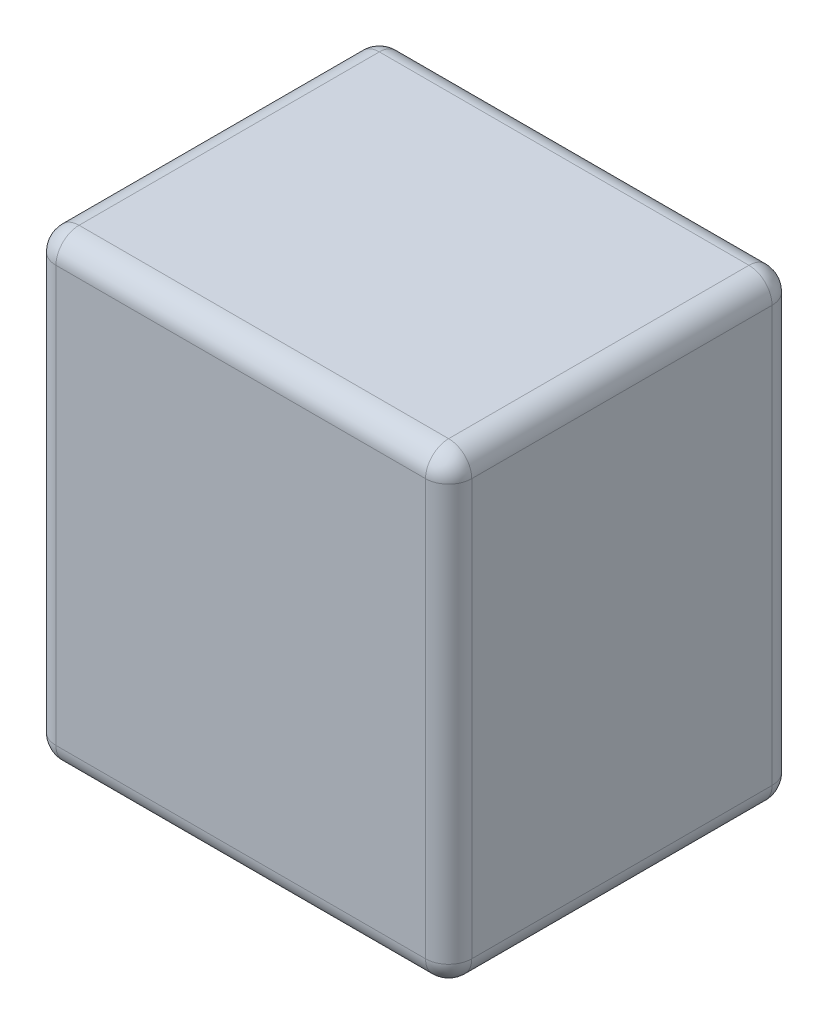
ISO-10303-21;
HEADER;
FILE_DESCRIPTION(('STEP AP214'),'2;1');
FILE_NAME('part.step','',(''),(''),'','','');
FILE_SCHEMA(('AUTOMOTIVE_DESIGN { 1 0 10303 214 1 1 1 1 }'));
ENDSEC;
DATA;
#1=APPLICATION_CONTEXT('core data for automotive mechanical design processes');
#2=APPLICATION_PROTOCOL_DEFINITION('international standard','automotive_design',2000,#1);
#3=PRODUCT_CONTEXT('',#1,'mechanical');
#4=PRODUCT('Part','Part','',(#3));
#5=PRODUCT_RELATED_PRODUCT_CATEGORY('part','',(#4));
#6=PRODUCT_DEFINITION_FORMATION('','',#4);
#7=PRODUCT_DEFINITION_CONTEXT('part definition',#1,'design');
#8=PRODUCT_DEFINITION('design','',#6,#7);
#9=PRODUCT_DEFINITION_SHAPE('','',#8);
#10=(LENGTH_UNIT() NAMED_UNIT(*) SI_UNIT(.MILLI.,.METRE.));
#11=(NAMED_UNIT(*) PLANE_ANGLE_UNIT() SI_UNIT($,.RADIAN.));
#12=(NAMED_UNIT(*) SI_UNIT($,.STERADIAN.) SOLID_ANGLE_UNIT());
#13=UNCERTAINTY_MEASURE_WITH_UNIT(LENGTH_MEASURE(1.E-05),#10,'distance_accuracy_value','');
#14=(GEOMETRIC_REPRESENTATION_CONTEXT(3) GLOBAL_UNCERTAINTY_ASSIGNED_CONTEXT((#13)) GLOBAL_UNIT_ASSIGNED_CONTEXT((#10,
#11,#12)) REPRESENTATION_CONTEXT('',''));
#15=CARTESIAN_POINT('',(0.,0.,0.));
#16=DIRECTION('',(0.,0.,1.));
#17=DIRECTION('',(1.,0.,0.));
#18=AXIS2_PLACEMENT_3D('',#15,#16,#17);
#19=CARTESIAN_POINT('',(22.86,25.4,38.1));
#20=DIRECTION('',(-1.,0.,0.));
#21=DIRECTION('',(0.,-1.,0.));
#22=AXIS2_PLACEMENT_3D('',#19,#20,#21);
#23=PLANE('',#22);
#24=DIRECTION('',(0.,1.,0.));
#25=VECTOR('',#24,1.);
#26=CARTESIAN_POINT('',(22.86,-25.4,35.56));
#27=LINE('',#26,#25);
#28=CARTESIAN_POINT('',(22.86,22.86,35.56));
#29=VERTEX_POINT('',#28);
#30=CARTESIAN_POINT('',(22.86,-22.86,35.56));
#31=VERTEX_POINT('',#30);
#32=EDGE_CURVE('E276',#29,#31,#27,.F.);
#33=ORIENTED_EDGE('',*,*,#32,.T.);
#34=DIRECTION('',(0.,0.,-1.));
#35=VECTOR('',#34,1.);
#36=CARTESIAN_POINT('',(22.86,-22.86,38.1));
#37=LINE('',#36,#35);
#38=CARTESIAN_POINT('',(22.86,-22.86,2.54));
#39=VERTEX_POINT('',#38);
#40=EDGE_CURVE('E158',#31,#39,#37,.T.);
#41=ORIENTED_EDGE('',*,*,#40,.T.);
#42=DIRECTION('',(0.,1.,0.));
#43=VECTOR('',#42,1.);
#44=CARTESIAN_POINT('',(22.86,25.4,2.54));
#45=LINE('',#44,#43);
#46=CARTESIAN_POINT('',(22.86,22.86,2.54));
#47=VERTEX_POINT('',#46);
#48=EDGE_CURVE('E281',#39,#47,#45,.T.);
#49=ORIENTED_EDGE('',*,*,#48,.T.);
#50=DIRECTION('',(0.,0.,-1.));
#51=VECTOR('',#50,1.);
#52=CARTESIAN_POINT('',(22.86,22.86,38.1));
#53=LINE('',#52,#51);
#54=EDGE_CURVE('E274',#47,#29,#53,.F.);
#55=ORIENTED_EDGE('',*,*,#54,.T.);
#56=EDGE_LOOP('',(#33,#41,#49,#55));
#57=FACE_BOUND('',#56,.T.);
#58=ADVANCED_FACE('F36',(#57),#23,.F.);
#59=CARTESIAN_POINT('',(-22.86,25.4,38.1));
#60=DIRECTION('',(0.,-1.,0.));
#61=DIRECTION('',(0.,0.,-1.));
#62=AXIS2_PLACEMENT_3D('',#59,#60,#61);
#63=PLANE('',#62);
#64=DIRECTION('',(-1.,0.,0.));
#65=VECTOR('',#64,1.);
#66=CARTESIAN_POINT('',(22.86,25.4,35.56));
#67=LINE('',#66,#65);
#68=CARTESIAN_POINT('',(-20.32,25.4,35.56));
#69=VERTEX_POINT('',#68);
#70=CARTESIAN_POINT('',(20.32,25.4,35.56));
#71=VERTEX_POINT('',#70);
#72=EDGE_CURVE('E45',#69,#71,#67,.F.);
#73=ORIENTED_EDGE('',*,*,#72,.T.);
#74=DIRECTION('',(0.,0.,-1.));
#75=VECTOR('',#74,1.);
#76=CARTESIAN_POINT('',(20.32,25.4,38.1));
#77=LINE('',#76,#75);
#78=CARTESIAN_POINT('',(20.32,25.4,2.54));
#79=VERTEX_POINT('',#78);
#80=EDGE_CURVE('E11',#71,#79,#77,.T.);
#81=ORIENTED_EDGE('',*,*,#80,.T.);
#82=DIRECTION('',(-1.,0.,0.));
#83=VECTOR('',#82,1.);
#84=CARTESIAN_POINT('',(-22.86,25.4,2.54));
#85=LINE('',#84,#83);
#86=CARTESIAN_POINT('',(-20.32,25.4,2.54));
#87=VERTEX_POINT('',#86);
#88=EDGE_CURVE('E236',#79,#87,#85,.T.);
#89=ORIENTED_EDGE('',*,*,#88,.T.);
#90=DIRECTION('',(0.,0.,-1.));
#91=VECTOR('',#90,1.);
#92=CARTESIAN_POINT('',(-20.32,25.4,38.1));
#93=LINE('',#92,#91);
#94=EDGE_CURVE('E217',#87,#69,#93,.F.);
#95=ORIENTED_EDGE('',*,*,#94,.T.);
#96=EDGE_LOOP('',(#73,#81,#89,#95));
#97=FACE_BOUND('',#96,.T.);
#98=ADVANCED_FACE('F296',(#97),#63,.F.);
#99=CARTESIAN_POINT('',(-22.86,25.4,38.1));
#100=DIRECTION('',(1.,0.,0.));
#101=DIRECTION('',(0.,1.,0.));
#102=AXIS2_PLACEMENT_3D('',#99,#100,#101);
#103=PLANE('',#102);
#104=DIRECTION('',(0.,0.,-1.));
#105=VECTOR('',#104,1.);
#106=CARTESIAN_POINT('',(-22.86,-22.86,38.1));
#107=LINE('',#106,#105);
#108=CARTESIAN_POINT('',(-22.86,-22.86,2.54));
#109=VERTEX_POINT('',#108);
#110=CARTESIAN_POINT('',(-22.86,-22.86,35.56));
#111=VERTEX_POINT('',#110);
#112=EDGE_CURVE('E226',#109,#111,#107,.F.);
#113=ORIENTED_EDGE('',*,*,#112,.T.);
#114=DIRECTION('',(0.,-1.,0.));
#115=VECTOR('',#114,1.);
#116=CARTESIAN_POINT('',(-22.86,25.4,35.56));
#117=LINE('',#116,#115);
#118=CARTESIAN_POINT('',(-22.86,22.86,35.56));
#119=VERTEX_POINT('',#118);
#120=EDGE_CURVE('E233',#111,#119,#117,.F.);
#121=ORIENTED_EDGE('',*,*,#120,.T.);
#122=DIRECTION('',(0.,0.,-1.));
#123=VECTOR('',#122,1.);
#124=CARTESIAN_POINT('',(-22.86,22.86,38.1));
#125=LINE('',#124,#123);
#126=CARTESIAN_POINT('',(-22.86,22.86,2.54));
#127=VERTEX_POINT('',#126);
#128=EDGE_CURVE('E219',#119,#127,#125,.T.);
#129=ORIENTED_EDGE('',*,*,#128,.T.);
#130=DIRECTION('',(0.,-1.,0.));
#131=VECTOR('',#130,1.);
#132=CARTESIAN_POINT('',(-22.86,25.4,2.54));
#133=LINE('',#132,#131);
#134=EDGE_CURVE('E223',#127,#109,#133,.T.);
#135=ORIENTED_EDGE('',*,*,#134,.T.);
#136=EDGE_LOOP('',(#113,#121,#129,#135));
#137=FACE_BOUND('',#136,.T.);
#138=ADVANCED_FACE('F318',(#137),#103,.F.);
#139=CARTESIAN_POINT('',(-22.86,-25.4,38.1));
#140=DIRECTION('',(0.,1.,0.));
#141=DIRECTION('',(0.,0.,1.));
#142=AXIS2_PLACEMENT_3D('',#139,#140,#141);
#143=PLANE('',#142);
#144=DIRECTION('',(0.,0.,-1.));
#145=VECTOR('',#144,1.);
#146=CARTESIAN_POINT('',(-20.32,-25.4,38.1));
#147=LINE('',#146,#145);
#148=CARTESIAN_POINT('',(-20.32,-25.4,35.56));
#149=VERTEX_POINT('',#148);
#150=CARTESIAN_POINT('',(-20.32,-25.4,2.54));
#151=VERTEX_POINT('',#150);
#152=EDGE_CURVE('E135',#149,#151,#147,.T.);
#153=ORIENTED_EDGE('',*,*,#152,.T.);
#154=DIRECTION('',(1.,0.,0.));
#155=VECTOR('',#154,1.);
#156=CARTESIAN_POINT('',(-22.86,-25.4,2.54));
#157=LINE('',#156,#155);
#158=CARTESIAN_POINT('',(20.32,-25.4,2.54));
#159=VERTEX_POINT('',#158);
#160=EDGE_CURVE('E131',#151,#159,#157,.T.);
#161=ORIENTED_EDGE('',*,*,#160,.T.);
#162=DIRECTION('',(0.,0.,-1.));
#163=VECTOR('',#162,1.);
#164=CARTESIAN_POINT('',(20.32,-25.4,38.1));
#165=LINE('',#164,#163);
#166=CARTESIAN_POINT('',(20.32,-25.4,35.56));
#167=VERTEX_POINT('',#166);
#168=EDGE_CURVE('E125',#159,#167,#165,.F.);
#169=ORIENTED_EDGE('',*,*,#168,.T.);
#170=DIRECTION('',(1.,0.,0.));
#171=VECTOR('',#170,1.);
#172=CARTESIAN_POINT('',(-22.86,-25.4,35.56));
#173=LINE('',#172,#171);
#174=EDGE_CURVE('E128',#167,#149,#173,.F.);
#175=ORIENTED_EDGE('',*,*,#174,.T.);
#176=EDGE_LOOP('',(#153,#161,#169,#175));
#177=FACE_BOUND('',#176,.T.);
#178=ADVANCED_FACE('F127',(#177),#143,.F.);
#179=CARTESIAN_POINT('',(0.,0.,38.1));
#180=DIRECTION('',(0.,0.,1.));
#181=DIRECTION('',(1.,0.,0.));
#182=AXIS2_PLACEMENT_3D('',#179,#180,#181);
#183=PLANE('',#182);
#184=DIRECTION('',(0.,-1.,0.));
#185=VECTOR('',#184,1.);
#186=CARTESIAN_POINT('',(-20.32,-25.4,38.1));
#187=LINE('',#186,#185);
#188=CARTESIAN_POINT('',(-20.32,22.86,38.1));
#189=VERTEX_POINT('',#188);
#190=CARTESIAN_POINT('',(-20.32,-22.86,38.1));
#191=VERTEX_POINT('',#190);
#192=EDGE_CURVE('E286',#189,#191,#187,.T.);
#193=ORIENTED_EDGE('',*,*,#192,.T.);
#194=DIRECTION('',(1.,0.,0.));
#195=VECTOR('',#194,1.);
#196=CARTESIAN_POINT('',(22.86,-22.86,38.1));
#197=LINE('',#196,#195);
#198=CARTESIAN_POINT('',(20.32,-22.86,38.1));
#199=VERTEX_POINT('',#198);
#200=EDGE_CURVE('E224',#191,#199,#197,.T.);
#201=ORIENTED_EDGE('',*,*,#200,.T.);
#202=DIRECTION('',(0.,1.,0.));
#203=VECTOR('',#202,1.);
#204=CARTESIAN_POINT('',(20.32,25.4,38.1));
#205=LINE('',#204,#203);
#206=CARTESIAN_POINT('',(20.32,22.86,38.1));
#207=VERTEX_POINT('',#206);
#208=EDGE_CURVE('E228',#199,#207,#205,.T.);
#209=ORIENTED_EDGE('',*,*,#208,.T.);
#210=DIRECTION('',(-1.,0.,0.));
#211=VECTOR('',#210,1.);
#212=CARTESIAN_POINT('',(-22.86,22.86,38.1));
#213=LINE('',#212,#211);
#214=EDGE_CURVE('E284',#207,#189,#213,.T.);
#215=ORIENTED_EDGE('',*,*,#214,.T.);
#216=EDGE_LOOP('',(#193,#201,#209,#215));
#217=FACE_BOUND('',#216,.T.);
#218=ADVANCED_FACE('F290',(#217),#183,.T.);
#219=CARTESIAN_POINT('',(0.,0.,0.));
#220=DIRECTION('',(0.,0.,1.));
#221=DIRECTION('',(1.,0.,0.));
#222=AXIS2_PLACEMENT_3D('',#219,#220,#221);
#223=PLANE('',#222);
#224=DIRECTION('',(0.,1.,0.));
#225=VECTOR('',#224,1.);
#226=CARTESIAN_POINT('',(20.32,0.,0.));
#227=LINE('',#226,#225);
#228=CARTESIAN_POINT('',(20.32,22.86,0.));
#229=VERTEX_POINT('',#228);
#230=CARTESIAN_POINT('',(20.32,-22.86,0.));
#231=VERTEX_POINT('',#230);
#232=EDGE_CURVE('E264',#229,#231,#227,.F.);
#233=ORIENTED_EDGE('',*,*,#232,.T.);
#234=DIRECTION('',(1.,0.,0.));
#235=VECTOR('',#234,1.);
#236=CARTESIAN_POINT('',(0.,-22.86,0.));
#237=LINE('',#236,#235);
#238=CARTESIAN_POINT('',(-20.32,-22.86,0.));
#239=VERTEX_POINT('',#238);
#240=EDGE_CURVE('E268',#231,#239,#237,.F.);
#241=ORIENTED_EDGE('',*,*,#240,.T.);
#242=DIRECTION('',(0.,-1.,0.));
#243=VECTOR('',#242,1.);
#244=CARTESIAN_POINT('',(-20.32,0.,0.));
#245=LINE('',#244,#243);
#246=CARTESIAN_POINT('',(-20.32,22.86,0.));
#247=VERTEX_POINT('',#246);
#248=EDGE_CURVE('E259',#239,#247,#245,.F.);
#249=ORIENTED_EDGE('',*,*,#248,.T.);
#250=DIRECTION('',(-1.,0.,0.));
#251=VECTOR('',#250,1.);
#252=CARTESIAN_POINT('',(0.,22.86,0.));
#253=LINE('',#252,#251);
#254=EDGE_CURVE('E265',#247,#229,#253,.F.);
#255=ORIENTED_EDGE('',*,*,#254,.T.);
#256=EDGE_LOOP('',(#233,#241,#249,#255));
#257=FACE_BOUND('',#256,.T.);
#258=ADVANCED_FACE('F269',(#257),#223,.F.);
#259=CARTESIAN_POINT('',(0.,22.86,35.56));
#260=DIRECTION('',(1.,0.,0.));
#261=DIRECTION('',(0.,0.,-1.));
#262=AXIS2_PLACEMENT_3D('',#259,#260,#261);
#263=CYLINDRICAL_SURFACE('',#262,2.54);
#264=CARTESIAN_POINT('',(-20.32,22.86,35.56));
#265=DIRECTION('',(-1.,0.,0.));
#266=DIRECTION('',(0.,0.,1.));
#267=AXIS2_PLACEMENT_3D('',#264,#265,#266);
#268=CIRCLE('',#267,2.54);
#269=EDGE_CURVE('E40',#189,#69,#268,.T.);
#270=ORIENTED_EDGE('',*,*,#269,.F.);
#271=ORIENTED_EDGE('',*,*,#214,.F.);
#272=CARTESIAN_POINT('',(20.32,22.86,35.56));
#273=DIRECTION('',(1.,0.,0.));
#274=DIRECTION('',(0.,0.,-1.));
#275=AXIS2_PLACEMENT_3D('',#272,#273,#274);
#276=CIRCLE('',#275,2.54);
#277=EDGE_CURVE('E198',#71,#207,#276,.T.);
#278=ORIENTED_EDGE('',*,*,#277,.F.);
#279=ORIENTED_EDGE('',*,*,#72,.F.);
#280=EDGE_LOOP('',(#270,#271,#278,#279));
#281=FACE_BOUND('',#280,.T.);
#282=ADVANCED_FACE('F38',(#281),#263,.T.);
#283=CARTESIAN_POINT('',(-20.32,22.86,35.56));
#284=DIRECTION('',(0.,1.,0.));
#285=DIRECTION('',(0.,0.,1.));
#286=AXIS2_PLACEMENT_3D('',#283,#284,#285);
#287=SPHERICAL_SURFACE('',#286,2.54);
#288=CARTESIAN_POINT('',(-20.32,22.86,35.56));
#289=DIRECTION('',(0.,1.,0.));
#290=DIRECTION('',(0.,0.,1.));
#291=AXIS2_PLACEMENT_3D('',#288,#289,#290);
#292=CIRCLE('',#291,2.54);
#293=EDGE_CURVE('E193',#189,#119,#292,.F.);
#294=ORIENTED_EDGE('',*,*,#293,.F.);
#295=ORIENTED_EDGE('',*,*,#269,.T.);
#296=CARTESIAN_POINT('',(-20.32,22.86,35.56));
#297=DIRECTION('',(0.,0.,1.));
#298=DIRECTION('',(1.,0.,0.));
#299=AXIS2_PLACEMENT_3D('',#296,#297,#298);
#300=CIRCLE('',#299,2.54);
#301=EDGE_CURVE('E196',#119,#69,#300,.F.);
#302=ORIENTED_EDGE('',*,*,#301,.F.);
#303=EDGE_LOOP('',(#294,#295,#302));
#304=FACE_BOUND('',#303,.T.);
#305=ADVANCED_FACE('F209',(#304),#287,.T.);
#306=CARTESIAN_POINT('',(20.32,22.86,35.56));
#307=DIRECTION('',(0.,0.,1.));
#308=DIRECTION('',(1.,0.,0.));
#309=AXIS2_PLACEMENT_3D('',#306,#307,#308);
#310=SPHERICAL_SURFACE('',#309,2.54);
#311=CARTESIAN_POINT('',(20.32,22.86,35.56));
#312=DIRECTION('',(0.,0.,1.));
#313=DIRECTION('',(1.,0.,0.));
#314=AXIS2_PLACEMENT_3D('',#311,#312,#313);
#315=CIRCLE('',#314,2.54);
#316=EDGE_CURVE('E189',#71,#29,#315,.F.);
#317=ORIENTED_EDGE('',*,*,#316,.F.);
#318=ORIENTED_EDGE('',*,*,#277,.T.);
#319=CARTESIAN_POINT('',(20.32,22.86,35.56));
#320=DIRECTION('',(0.,1.,0.));
#321=DIRECTION('',(0.,0.,1.));
#322=AXIS2_PLACEMENT_3D('',#319,#320,#321);
#323=CIRCLE('',#322,2.54);
#324=EDGE_CURVE('E191',#29,#207,#323,.F.);
#325=ORIENTED_EDGE('',*,*,#324,.F.);
#326=EDGE_LOOP('',(#317,#318,#325));
#327=FACE_BOUND('',#326,.T.);
#328=ADVANCED_FACE('F294',(#327),#310,.T.);
#329=CARTESIAN_POINT('',(-20.32,22.86,38.1));
#330=DIRECTION('',(0.,0.,-1.));
#331=DIRECTION('',(-1.,0.,0.));
#332=AXIS2_PLACEMENT_3D('',#329,#330,#331);
#333=CYLINDRICAL_SURFACE('',#332,2.54);
#334=ORIENTED_EDGE('',*,*,#301,.T.);
#335=ORIENTED_EDGE('',*,*,#94,.F.);
#336=CARTESIAN_POINT('',(-20.32,22.86,2.54));
#337=DIRECTION('',(0.,0.,-1.));
#338=DIRECTION('',(-1.,0.,0.));
#339=AXIS2_PLACEMENT_3D('',#336,#337,#338);
#340=CIRCLE('',#339,2.54);
#341=EDGE_CURVE('E183',#127,#87,#340,.T.);
#342=ORIENTED_EDGE('',*,*,#341,.F.);
#343=ORIENTED_EDGE('',*,*,#128,.F.);
#344=EDGE_LOOP('',(#334,#335,#342,#343));
#345=FACE_BOUND('',#344,.T.);
#346=ADVANCED_FACE('F215',(#345),#333,.T.);
#347=CARTESIAN_POINT('',(-20.32,0.,35.56));
#348=DIRECTION('',(0.,1.,0.));
#349=DIRECTION('',(-1.,0.,0.));
#350=AXIS2_PLACEMENT_3D('',#347,#348,#349);
#351=CYLINDRICAL_SURFACE('',#350,2.54);
#352=ORIENTED_EDGE('',*,*,#293,.T.);
#353=ORIENTED_EDGE('',*,*,#120,.F.);
#354=CARTESIAN_POINT('',(-20.32,-22.86,35.56));
#355=DIRECTION('',(0.,-1.,0.));
#356=DIRECTION('',(0.,0.,-1.));
#357=AXIS2_PLACEMENT_3D('',#354,#355,#356);
#358=CIRCLE('',#357,2.54);
#359=EDGE_CURVE('E180',#191,#111,#358,.T.);
#360=ORIENTED_EDGE('',*,*,#359,.F.);
#361=ORIENTED_EDGE('',*,*,#192,.F.);
#362=EDGE_LOOP('',(#352,#353,#360,#361));
#363=FACE_BOUND('',#362,.T.);
#364=ADVANCED_FACE('F321',(#363),#351,.T.);
#365=CARTESIAN_POINT('',(0.,-22.86,35.56));
#366=DIRECTION('',(-1.,0.,0.));
#367=DIRECTION('',(0.,0.,1.));
#368=AXIS2_PLACEMENT_3D('',#365,#366,#367);
#369=CYLINDRICAL_SURFACE('',#368,2.54);
#370=CARTESIAN_POINT('',(20.32,-22.86,35.56));
#371=DIRECTION('',(1.,0.,0.));
#372=DIRECTION('',(0.,0.,-1.));
#373=AXIS2_PLACEMENT_3D('',#370,#371,#372);
#374=CIRCLE('',#373,2.54);
#375=EDGE_CURVE('E142',#199,#167,#374,.T.);
#376=ORIENTED_EDGE('',*,*,#375,.F.);
#377=ORIENTED_EDGE('',*,*,#200,.F.);
#378=CARTESIAN_POINT('',(-20.32,-22.86,35.56));
#379=DIRECTION('',(-1.,0.,0.));
#380=DIRECTION('',(0.,0.,1.));
#381=AXIS2_PLACEMENT_3D('',#378,#379,#380);
#382=CIRCLE('',#381,2.54);
#383=EDGE_CURVE('E145',#149,#191,#382,.T.);
#384=ORIENTED_EDGE('',*,*,#383,.F.);
#385=ORIENTED_EDGE('',*,*,#174,.F.);
#386=EDGE_LOOP('',(#376,#377,#384,#385));
#387=FACE_BOUND('',#386,.T.);
#388=ADVANCED_FACE('F140',(#387),#369,.T.);
#389=CARTESIAN_POINT('',(20.32,0.,35.56));
#390=DIRECTION('',(0.,-1.,0.));
#391=DIRECTION('',(1.,0.,0.));
#392=AXIS2_PLACEMENT_3D('',#389,#390,#391);
#393=CYLINDRICAL_SURFACE('',#392,2.54);
#394=ORIENTED_EDGE('',*,*,#324,.T.);
#395=ORIENTED_EDGE('',*,*,#208,.F.);
#396=CARTESIAN_POINT('',(20.32,-22.86,35.56));
#397=DIRECTION('',(0.,-1.,0.));
#398=DIRECTION('',(0.,0.,-1.));
#399=AXIS2_PLACEMENT_3D('',#396,#397,#398);
#400=CIRCLE('',#399,2.54);
#401=EDGE_CURVE('E154',#31,#199,#400,.T.);
#402=ORIENTED_EDGE('',*,*,#401,.F.);
#403=ORIENTED_EDGE('',*,*,#32,.F.);
#404=EDGE_LOOP('',(#394,#395,#402,#403));
#405=FACE_BOUND('',#404,.T.);
#406=ADVANCED_FACE('F292',(#405),#393,.T.);
#407=CARTESIAN_POINT('',(20.32,22.86,38.1));
#408=DIRECTION('',(0.,0.,-1.));
#409=DIRECTION('',(-1.,0.,0.));
#410=AXIS2_PLACEMENT_3D('',#407,#408,#409);
#411=CYLINDRICAL_SURFACE('',#410,2.54);
#412=ORIENTED_EDGE('',*,*,#316,.T.);
#413=ORIENTED_EDGE('',*,*,#54,.F.);
#414=CARTESIAN_POINT('',(20.32,22.86,2.54));
#415=DIRECTION('',(0.,0.,-1.));
#416=DIRECTION('',(-1.,0.,0.));
#417=AXIS2_PLACEMENT_3D('',#414,#415,#416);
#418=CIRCLE('',#417,2.54);
#419=EDGE_CURVE('E175',#79,#47,#418,.T.);
#420=ORIENTED_EDGE('',*,*,#419,.F.);
#421=ORIENTED_EDGE('',*,*,#80,.F.);
#422=EDGE_LOOP('',(#412,#413,#420,#421));
#423=FACE_BOUND('',#422,.T.);
#424=ADVANCED_FACE('F301',(#423),#411,.T.);
#425=CARTESIAN_POINT('',(-22.86,22.86,2.54));
#426=DIRECTION('',(-1.,0.,0.));
#427=DIRECTION('',(0.,0.,1.));
#428=AXIS2_PLACEMENT_3D('',#425,#426,#427);
#429=CYLINDRICAL_SURFACE('',#428,2.54);
#430=CARTESIAN_POINT('',(-20.32,22.86,2.54));
#431=DIRECTION('',(-1.,0.,0.));
#432=DIRECTION('',(0.,0.,1.));
#433=AXIS2_PLACEMENT_3D('',#430,#431,#432);
#434=CIRCLE('',#433,2.54);
#435=EDGE_CURVE('E186',#87,#247,#434,.T.);
#436=ORIENTED_EDGE('',*,*,#435,.F.);
#437=ORIENTED_EDGE('',*,*,#88,.F.);
#438=CARTESIAN_POINT('',(20.32,22.86,2.54));
#439=DIRECTION('',(1.,0.,0.));
#440=DIRECTION('',(0.,1.,0.));
#441=AXIS2_PLACEMENT_3D('',#438,#439,#440);
#442=CIRCLE('',#441,2.54);
#443=EDGE_CURVE('E172',#229,#79,#442,.T.);
#444=ORIENTED_EDGE('',*,*,#443,.F.);
#445=ORIENTED_EDGE('',*,*,#254,.F.);
#446=EDGE_LOOP('',(#436,#437,#444,#445));
#447=FACE_BOUND('',#446,.T.);
#448=ADVANCED_FACE('F299',(#447),#429,.T.);
#449=CARTESIAN_POINT('',(-20.32,22.86,2.54));
#450=DIRECTION('',(0.,1.,0.));
#451=DIRECTION('',(0.,0.,1.));
#452=AXIS2_PLACEMENT_3D('',#449,#450,#451);
#453=SPHERICAL_SURFACE('',#452,2.54);
#454=ORIENTED_EDGE('',*,*,#341,.T.);
#455=ORIENTED_EDGE('',*,*,#435,.T.);
#456=CARTESIAN_POINT('',(-20.32,22.86,2.54));
#457=DIRECTION('',(0.,1.,0.));
#458=DIRECTION('',(0.,0.,1.));
#459=AXIS2_PLACEMENT_3D('',#456,#457,#458);
#460=CIRCLE('',#459,2.54);
#461=EDGE_CURVE('E163',#127,#247,#460,.F.);
#462=ORIENTED_EDGE('',*,*,#461,.F.);
#463=EDGE_LOOP('',(#454,#455,#462));
#464=FACE_BOUND('',#463,.T.);
#465=ADVANCED_FACE('F325',(#464),#453,.T.);
#466=CARTESIAN_POINT('',(-20.32,-22.86,35.56));
#467=DIRECTION('',(0.,0.,1.));
#468=DIRECTION('',(1.,0.,0.));
#469=AXIS2_PLACEMENT_3D('',#466,#467,#468);
#470=SPHERICAL_SURFACE('',#469,2.54);
#471=ORIENTED_EDGE('',*,*,#383,.T.);
#472=ORIENTED_EDGE('',*,*,#359,.T.);
#473=CARTESIAN_POINT('',(-20.32,-22.86,35.56));
#474=DIRECTION('',(0.,0.,1.));
#475=DIRECTION('',(1.,0.,0.));
#476=AXIS2_PLACEMENT_3D('',#473,#474,#475);
#477=CIRCLE('',#476,2.54);
#478=EDGE_CURVE('E159',#149,#111,#477,.F.);
#479=ORIENTED_EDGE('',*,*,#478,.F.);
#480=EDGE_LOOP('',(#471,#472,#479));
#481=FACE_BOUND('',#480,.T.);
#482=ADVANCED_FACE('F323',(#481),#470,.T.);
#483=CARTESIAN_POINT('',(20.32,-22.86,35.56));
#484=DIRECTION('',(0.,0.,1.));
#485=DIRECTION('',(1.,0.,0.));
#486=AXIS2_PLACEMENT_3D('',#483,#484,#485);
#487=SPHERICAL_SURFACE('',#486,2.54);
#488=ORIENTED_EDGE('',*,*,#401,.T.);
#489=ORIENTED_EDGE('',*,*,#375,.T.);
#490=CARTESIAN_POINT('',(20.32,-22.86,35.56));
#491=DIRECTION('',(0.,0.,1.));
#492=DIRECTION('',(1.,0.,0.));
#493=AXIS2_PLACEMENT_3D('',#490,#491,#492);
#494=CIRCLE('',#493,2.54);
#495=EDGE_CURVE('E151',#31,#167,#494,.F.);
#496=ORIENTED_EDGE('',*,*,#495,.F.);
#497=EDGE_LOOP('',(#488,#489,#496));
#498=FACE_BOUND('',#497,.T.);
#499=ADVANCED_FACE('F150',(#498),#487,.T.);
#500=CARTESIAN_POINT('',(20.32,22.86,2.54));
#501=DIRECTION('',(0.,1.,0.));
#502=DIRECTION('',(-1.,0.,0.));
#503=AXIS2_PLACEMENT_3D('',#500,#501,#502);
#504=SPHERICAL_SURFACE('',#503,2.54);
#505=ORIENTED_EDGE('',*,*,#443,.T.);
#506=ORIENTED_EDGE('',*,*,#419,.T.);
#507=CARTESIAN_POINT('',(20.32,22.86,2.54));
#508=DIRECTION('',(0.,1.,0.));
#509=DIRECTION('',(0.,0.,1.));
#510=AXIS2_PLACEMENT_3D('',#507,#508,#509);
#511=CIRCLE('',#510,2.54);
#512=EDGE_CURVE('E160',#229,#47,#511,.F.);
#513=ORIENTED_EDGE('',*,*,#512,.F.);
#514=EDGE_LOOP('',(#505,#506,#513));
#515=FACE_BOUND('',#514,.T.);
#516=ADVANCED_FACE('F303',(#515),#504,.T.);
#517=CARTESIAN_POINT('',(-20.32,25.4,2.54));
#518=DIRECTION('',(0.,-1.,0.));
#519=DIRECTION('',(1.,0.,0.));
#520=AXIS2_PLACEMENT_3D('',#517,#518,#519);
#521=CYLINDRICAL_SURFACE('',#520,2.54);
#522=ORIENTED_EDGE('',*,*,#461,.T.);
#523=ORIENTED_EDGE('',*,*,#248,.F.);
#524=CARTESIAN_POINT('',(-20.32,-22.86,2.54));
#525=DIRECTION('',(0.,-1.,0.));
#526=DIRECTION('',(0.,0.,-1.));
#527=AXIS2_PLACEMENT_3D('',#524,#525,#526);
#528=CIRCLE('',#527,2.54);
#529=EDGE_CURVE('E166',#109,#239,#528,.T.);
#530=ORIENTED_EDGE('',*,*,#529,.F.);
#531=ORIENTED_EDGE('',*,*,#134,.F.);
#532=EDGE_LOOP('',(#522,#523,#530,#531));
#533=FACE_BOUND('',#532,.T.);
#534=ADVANCED_FACE('F261',(#533),#521,.T.);
#535=CARTESIAN_POINT('',(-20.32,-22.86,38.1));
#536=DIRECTION('',(0.,0.,-1.));
#537=DIRECTION('',(-1.,0.,0.));
#538=AXIS2_PLACEMENT_3D('',#535,#536,#537);
#539=CYLINDRICAL_SURFACE('',#538,2.54);
#540=ORIENTED_EDGE('',*,*,#478,.T.);
#541=ORIENTED_EDGE('',*,*,#112,.F.);
#542=CARTESIAN_POINT('',(-20.32,-22.86,2.54));
#543=DIRECTION('',(0.,0.,-1.));
#544=DIRECTION('',(-1.,0.,0.));
#545=AXIS2_PLACEMENT_3D('',#542,#543,#544);
#546=CIRCLE('',#545,2.54);
#547=EDGE_CURVE('E248',#151,#109,#546,.T.);
#548=ORIENTED_EDGE('',*,*,#547,.F.);
#549=ORIENTED_EDGE('',*,*,#152,.F.);
#550=EDGE_LOOP('',(#540,#541,#548,#549));
#551=FACE_BOUND('',#550,.T.);
#552=ADVANCED_FACE('F316',(#551),#539,.T.);
#553=CARTESIAN_POINT('',(20.32,-22.86,38.1));
#554=DIRECTION('',(0.,0.,-1.));
#555=DIRECTION('',(-1.,0.,0.));
#556=AXIS2_PLACEMENT_3D('',#553,#554,#555);
#557=CYLINDRICAL_SURFACE('',#556,2.54);
#558=ORIENTED_EDGE('',*,*,#495,.T.);
#559=ORIENTED_EDGE('',*,*,#168,.F.);
#560=CARTESIAN_POINT('',(20.32,-22.86,2.54));
#561=DIRECTION('',(0.,0.,-1.));
#562=DIRECTION('',(-1.,0.,0.));
#563=AXIS2_PLACEMENT_3D('',#560,#561,#562);
#564=CIRCLE('',#563,2.54);
#565=EDGE_CURVE('E245',#39,#159,#564,.T.);
#566=ORIENTED_EDGE('',*,*,#565,.F.);
#567=ORIENTED_EDGE('',*,*,#40,.F.);
#568=EDGE_LOOP('',(#558,#559,#566,#567));
#569=FACE_BOUND('',#568,.T.);
#570=ADVANCED_FACE('F156',(#569),#557,.T.);
#571=CARTESIAN_POINT('',(20.32,25.4,2.54));
#572=DIRECTION('',(0.,1.,0.));
#573=DIRECTION('',(-1.,0.,0.));
#574=AXIS2_PLACEMENT_3D('',#571,#572,#573);
#575=CYLINDRICAL_SURFACE('',#574,2.54);
#576=ORIENTED_EDGE('',*,*,#512,.T.);
#577=ORIENTED_EDGE('',*,*,#48,.F.);
#578=CARTESIAN_POINT('',(20.32,-22.86,2.54));
#579=DIRECTION('',(0.,-1.,0.));
#580=DIRECTION('',(0.,0.,-1.));
#581=AXIS2_PLACEMENT_3D('',#578,#579,#580);
#582=CIRCLE('',#581,2.54);
#583=EDGE_CURVE('E243',#231,#39,#582,.T.);
#584=ORIENTED_EDGE('',*,*,#583,.F.);
#585=ORIENTED_EDGE('',*,*,#232,.F.);
#586=EDGE_LOOP('',(#576,#577,#584,#585));
#587=FACE_BOUND('',#586,.T.);
#588=ADVANCED_FACE('F306',(#587),#575,.T.);
#589=CARTESIAN_POINT('',(-20.32,-22.86,2.54));
#590=DIRECTION('',(-1.,0.,0.));
#591=DIRECTION('',(0.,0.,1.));
#592=AXIS2_PLACEMENT_3D('',#589,#590,#591);
#593=SPHERICAL_SURFACE('',#592,2.54);
#594=ORIENTED_EDGE('',*,*,#547,.T.);
#595=ORIENTED_EDGE('',*,*,#529,.T.);
#596=CARTESIAN_POINT('',(-20.32,-22.86,2.54));
#597=DIRECTION('',(-1.,0.,0.));
#598=DIRECTION('',(0.,0.,1.));
#599=AXIS2_PLACEMENT_3D('',#596,#597,#598);
#600=CIRCLE('',#599,2.54);
#601=EDGE_CURVE('E241',#151,#239,#600,.F.);
#602=ORIENTED_EDGE('',*,*,#601,.F.);
#603=EDGE_LOOP('',(#594,#595,#602));
#604=FACE_BOUND('',#603,.T.);
#605=ADVANCED_FACE('F255',(#604),#593,.T.);
#606=CARTESIAN_POINT('',(20.32,-22.86,2.54));
#607=DIRECTION('',(1.,0.,0.));
#608=DIRECTION('',(0.,0.,-1.));
#609=AXIS2_PLACEMENT_3D('',#606,#607,#608);
#610=SPHERICAL_SURFACE('',#609,2.54);
#611=ORIENTED_EDGE('',*,*,#583,.T.);
#612=ORIENTED_EDGE('',*,*,#565,.T.);
#613=CARTESIAN_POINT('',(20.32,-22.86,2.54));
#614=DIRECTION('',(1.,0.,0.));
#615=DIRECTION('',(0.,0.,-1.));
#616=AXIS2_PLACEMENT_3D('',#613,#614,#615);
#617=CIRCLE('',#616,2.54);
#618=EDGE_CURVE('E239',#231,#159,#617,.F.);
#619=ORIENTED_EDGE('',*,*,#618,.F.);
#620=EDGE_LOOP('',(#611,#612,#619));
#621=FACE_BOUND('',#620,.T.);
#622=ADVANCED_FACE('F308',(#621),#610,.T.);
#623=CARTESIAN_POINT('',(-22.86,-22.86,2.54));
#624=DIRECTION('',(1.,0.,0.));
#625=DIRECTION('',(0.,0.,-1.));
#626=AXIS2_PLACEMENT_3D('',#623,#624,#625);
#627=CYLINDRICAL_SURFACE('',#626,2.54);
#628=ORIENTED_EDGE('',*,*,#601,.T.);
#629=ORIENTED_EDGE('',*,*,#240,.F.);
#630=ORIENTED_EDGE('',*,*,#618,.T.);
#631=ORIENTED_EDGE('',*,*,#160,.F.);
#632=EDGE_LOOP('',(#628,#629,#630,#631));
#633=FACE_BOUND('',#632,.T.);
#634=ADVANCED_FACE('F309',(#633),#627,.T.);
#635=CLOSED_SHELL('',(#58,#98,#138,#178,#218,#258,#282,#305,#328,#346,#364,#388,#406,#424,#448,
#465,#482,#499,#516,#534,#552,#570,#588,#605,#622,#634));
#636=MANIFOLD_SOLID_BREP('B2',#635);
#637=ADVANCED_BREP_SHAPE_REPRESENTATION('',(#18,#636),#14);
#638=SHAPE_DEFINITION_REPRESENTATION(#9,#637);
ENDSEC;
END-ISO-10303-21;
